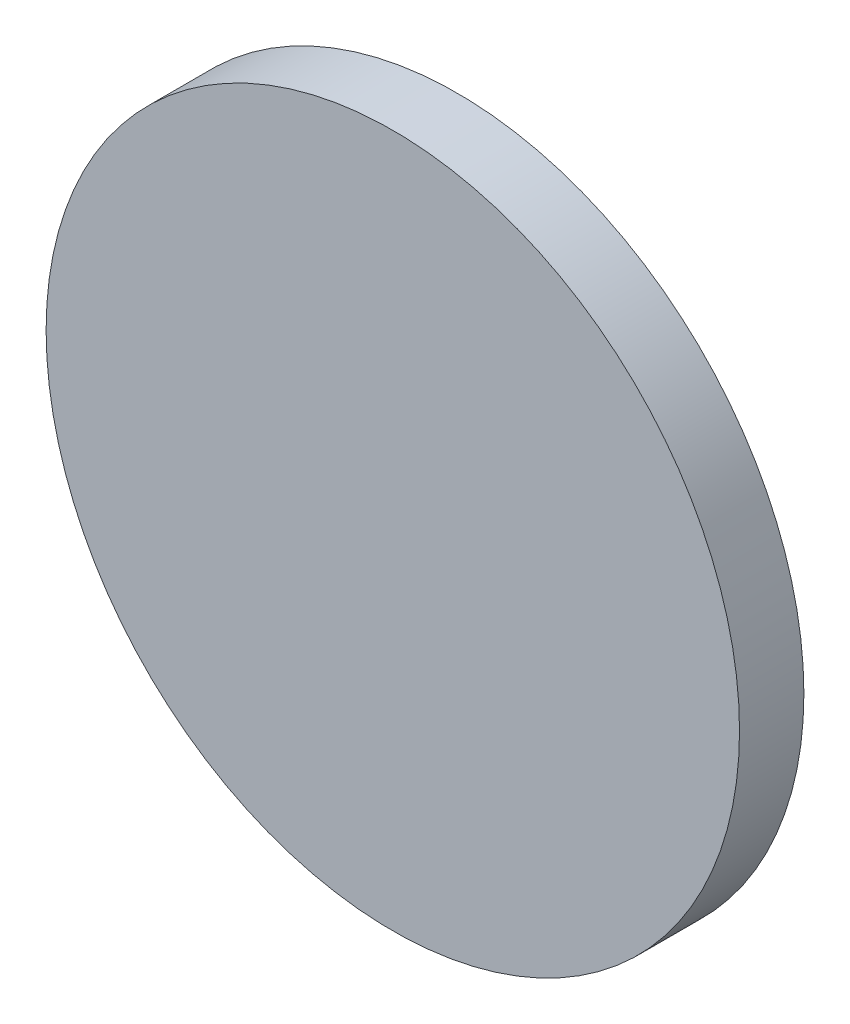
ISO-10303-21;
HEADER;
FILE_DESCRIPTION(('STEP AP214'),'2;1');
FILE_NAME('part.step','',(''),(''),'','','');
FILE_SCHEMA(('AUTOMOTIVE_DESIGN { 1 0 10303 214 1 1 1 1 }'));
ENDSEC;
DATA;
#1=APPLICATION_CONTEXT('core data for automotive mechanical design processes');
#2=APPLICATION_PROTOCOL_DEFINITION('international standard','automotive_design',2000,#1);
#3=PRODUCT_CONTEXT('',#1,'mechanical');
#4=PRODUCT('Part','Part','',(#3));
#5=PRODUCT_RELATED_PRODUCT_CATEGORY('part','',(#4));
#6=PRODUCT_DEFINITION_FORMATION('','',#4);
#7=PRODUCT_DEFINITION_CONTEXT('part definition',#1,'design');
#8=PRODUCT_DEFINITION('design','',#6,#7);
#9=PRODUCT_DEFINITION_SHAPE('','',#8);
#10=(LENGTH_UNIT() NAMED_UNIT(*) SI_UNIT(.MILLI.,.METRE.));
#11=(NAMED_UNIT(*) PLANE_ANGLE_UNIT() SI_UNIT($,.RADIAN.));
#12=(NAMED_UNIT(*) SI_UNIT($,.STERADIAN.) SOLID_ANGLE_UNIT());
#13=UNCERTAINTY_MEASURE_WITH_UNIT(LENGTH_MEASURE(1.E-05),#10,'distance_accuracy_value','');
#14=(GEOMETRIC_REPRESENTATION_CONTEXT(3) GLOBAL_UNCERTAINTY_ASSIGNED_CONTEXT((#13)) GLOBAL_UNIT_ASSIGNED_CONTEXT((#10,
#11,#12)) REPRESENTATION_CONTEXT('',''));
#15=CARTESIAN_POINT('',(0.,0.,0.));
#16=DIRECTION('',(0.,0.,1.));
#17=DIRECTION('',(1.,0.,0.));
#18=AXIS2_PLACEMENT_3D('',#15,#16,#17);
#19=CARTESIAN_POINT('',(0.,0.,2.54));
#20=DIRECTION('',(0.,0.,-1.));
#21=DIRECTION('',(-1.,0.,0.));
#22=AXIS2_PLACEMENT_3D('',#19,#20,#21);
#23=CYLINDRICAL_SURFACE('',#22,13.6823006670143);
#24=CARTESIAN_POINT('',(0.,0.,2.54));
#25=DIRECTION('',(0.,0.,1.));
#26=DIRECTION('',(1.,0.,0.));
#27=AXIS2_PLACEMENT_3D('',#24,#25,#26);
#28=CIRCLE('',#27,13.6823006670143);
#29=CARTESIAN_POINT('',(13.6823006670143,0.,2.54));
#30=VERTEX_POINT('',#29);
#31=EDGE_CURVE('E10',#30,#30,#28,.T.);
#32=ORIENTED_EDGE('',*,*,#31,.F.);
#33=EDGE_LOOP('',(#32));
#34=FACE_BOUND('',#33,.T.);
#35=CARTESIAN_POINT('',(0.,0.,0.));
#36=DIRECTION('',(0.,0.,1.));
#37=DIRECTION('',(1.,0.,0.));
#38=AXIS2_PLACEMENT_3D('',#35,#36,#37);
#39=CIRCLE('',#38,13.6823006670143);
#40=CARTESIAN_POINT('',(13.6823006670143,0.,0.));
#41=VERTEX_POINT('',#40);
#42=EDGE_CURVE('E33',#41,#41,#39,.T.);
#43=ORIENTED_EDGE('',*,*,#42,.T.);
#44=EDGE_LOOP('',(#43));
#45=FACE_BOUND('',#44,.T.);
#46=ADVANCED_FACE('F27',(#34,#45),#23,.T.);
#47=CARTESIAN_POINT('',(0.,0.,2.54));
#48=DIRECTION('',(0.,0.,1.));
#49=DIRECTION('',(1.,0.,0.));
#50=AXIS2_PLACEMENT_3D('',#47,#48,#49);
#51=PLANE('',#50);
#52=ORIENTED_EDGE('',*,*,#31,.T.);
#53=EDGE_LOOP('',(#52));
#54=FACE_BOUND('',#53,.T.);
#55=ADVANCED_FACE('F42',(#54),#51,.T.);
#56=CARTESIAN_POINT('',(0.,0.,0.));
#57=DIRECTION('',(0.,0.,1.));
#58=DIRECTION('',(1.,0.,0.));
#59=AXIS2_PLACEMENT_3D('',#56,#57,#58);
#60=PLANE('',#59);
#61=ORIENTED_EDGE('',*,*,#42,.F.);
#62=EDGE_LOOP('',(#61));
#63=FACE_BOUND('',#62,.T.);
#64=ADVANCED_FACE('F40',(#63),#60,.F.);
#65=CLOSED_SHELL('',(#46,#55,#64));
#66=MANIFOLD_SOLID_BREP('B2',#65);
#67=ADVANCED_BREP_SHAPE_REPRESENTATION('',(#18,#66),#14);
#68=SHAPE_DEFINITION_REPRESENTATION(#9,#67);
ENDSEC;
END-ISO-10303-21;
